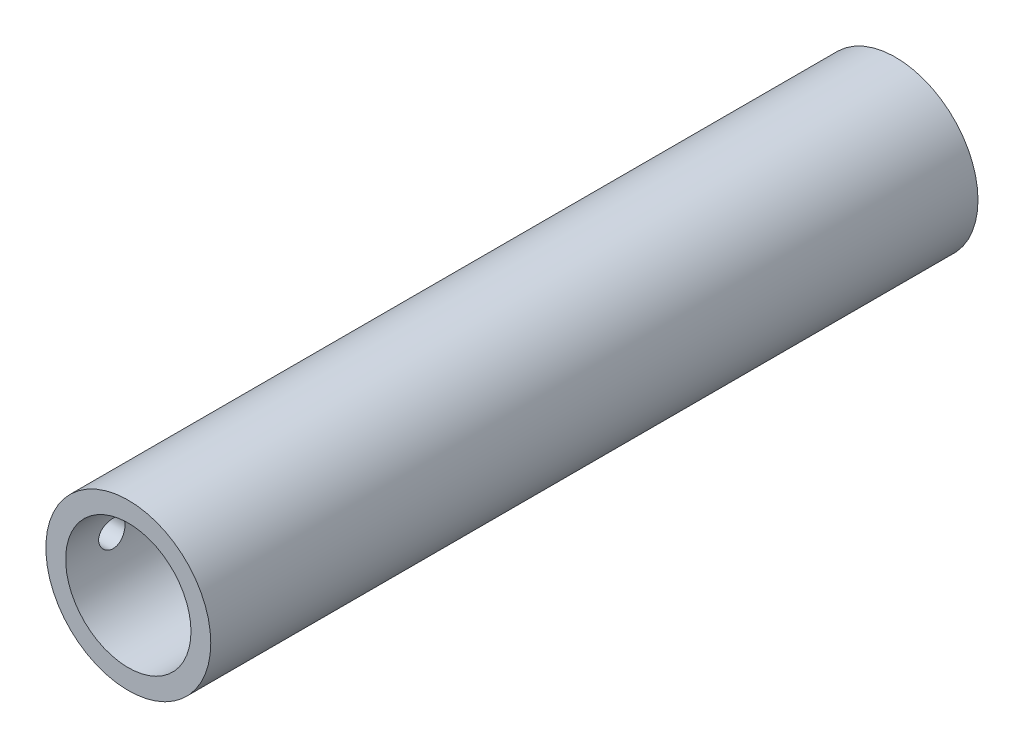
ISO-10303-21;
HEADER;
FILE_DESCRIPTION(('STEP AP214'),'2;1');
FILE_NAME('part.step','',(''),(''),'','','');
FILE_SCHEMA(('AUTOMOTIVE_DESIGN { 1 0 10303 214 1 1 1 1 }'));
ENDSEC;
DATA;
#1=APPLICATION_CONTEXT('core data for automotive mechanical design processes');
#2=APPLICATION_PROTOCOL_DEFINITION('international standard','automotive_design',2000,#1);
#3=PRODUCT_CONTEXT('',#1,'mechanical');
#4=PRODUCT('Part','Part','',(#3));
#5=PRODUCT_RELATED_PRODUCT_CATEGORY('part','',(#4));
#6=PRODUCT_DEFINITION_FORMATION('','',#4);
#7=PRODUCT_DEFINITION_CONTEXT('part definition',#1,'design');
#8=PRODUCT_DEFINITION('design','',#6,#7);
#9=PRODUCT_DEFINITION_SHAPE('','',#8);
#10=(LENGTH_UNIT() NAMED_UNIT(*) SI_UNIT(.MILLI.,.METRE.));
#11=(NAMED_UNIT(*) PLANE_ANGLE_UNIT() SI_UNIT($,.RADIAN.));
#12=(NAMED_UNIT(*) SI_UNIT($,.STERADIAN.) SOLID_ANGLE_UNIT());
#13=UNCERTAINTY_MEASURE_WITH_UNIT(LENGTH_MEASURE(1.E-05),#10,'distance_accuracy_value','');
#14=(GEOMETRIC_REPRESENTATION_CONTEXT(3) GLOBAL_UNCERTAINTY_ASSIGNED_CONTEXT((#13)) GLOBAL_UNIT_ASSIGNED_CONTEXT((#10,
#11,#12)) REPRESENTATION_CONTEXT('',''));
#15=CARTESIAN_POINT('',(0.,0.,0.));
#16=DIRECTION('',(0.,0.,1.));
#17=DIRECTION('',(1.,0.,0.));
#18=AXIS2_PLACEMENT_3D('',#15,#16,#17);
#19=CARTESIAN_POINT('',(12.7,12.7,116.3));
#20=DIRECTION('',(0.,0.,-1.));
#21=DIRECTION('',(-1.,0.,0.));
#22=AXIS2_PLACEMENT_3D('',#19,#20,#21);
#23=CYLINDRICAL_SURFACE('',#22,12.5);
#24=CARTESIAN_POINT('',(12.7,12.7,116.3));
#25=DIRECTION('',(0.,0.,1.));
#26=DIRECTION('',(1.,0.,0.));
#27=AXIS2_PLACEMENT_3D('',#24,#25,#26);
#28=CIRCLE('',#27,12.5);
#29=CARTESIAN_POINT('',(25.2,12.7,116.3));
#30=VERTEX_POINT('',#29);
#31=EDGE_CURVE('E10',#30,#30,#28,.T.);
#32=ORIENTED_EDGE('',*,*,#31,.F.);
#33=EDGE_LOOP('',(#32));
#34=FACE_BOUND('',#33,.T.);
#35=CARTESIAN_POINT('',(12.7,12.7,0.));
#36=DIRECTION('',(0.,0.,1.));
#37=DIRECTION('',(1.,0.,0.));
#38=AXIS2_PLACEMENT_3D('',#35,#36,#37);
#39=CIRCLE('',#38,12.5);
#40=CARTESIAN_POINT('',(25.2,12.7,0.));
#41=VERTEX_POINT('',#40);
#42=EDGE_CURVE('E38',#41,#41,#39,.T.);
#43=ORIENTED_EDGE('',*,*,#42,.T.);
#44=EDGE_LOOP('',(#43));
#45=FACE_BOUND('',#44,.T.);
#46=CARTESIAN_POINT('',(0.199999999999994,12.7,111.3));
#47=CARTESIAN_POINT('',(0.200001865790051,12.5884229798721,111.29999547137));
#48=CARTESIAN_POINT('',(0.201509532362699,12.4767834761397,111.290631392707));
#49=CARTESIAN_POINT('',(0.20737876581435,12.2566312203418,111.253435552302));
#50=CARTESIAN_POINT('',(0.211743020689556,12.1481215138648,111.2255863961));
#51=CARTESIAN_POINT('',(0.222835535987103,11.9374462288737,111.152279119554));
#52=CARTESIAN_POINT('',(0.229561922601623,11.835275697056,111.106834953879));
#53=CARTESIAN_POINT('',(0.244637601988447,11.6400241556545,110.999663205602));
#54=CARTESIAN_POINT('',(0.252986692791456,11.5469420170511,110.937937649116));
#55=CARTESIAN_POINT('',(0.270463570966221,11.3716725039533,110.799374395738));
#56=CARTESIAN_POINT('',(0.279596995569625,11.289577133474,110.722421021055));
#57=CARTESIAN_POINT('',(0.297569600906174,11.1394058971622,110.555835532725));
#58=CARTESIAN_POINT('',(0.306408763735023,11.0713308830929,110.466202649331));
#59=CARTESIAN_POINT('',(0.322846664218036,10.9507683458679,110.276176113848));
#60=CARTESIAN_POINT('',(0.330438116515013,10.898371001539,110.175724562638));
#61=CARTESIAN_POINT('',(0.343443340504492,10.8112276903739,109.967304337131));
#62=CARTESIAN_POINT('',(0.348857247496583,10.7764806268199,109.859336130363));
#63=CARTESIAN_POINT('',(0.356838552576357,10.7259124131867,109.639919623135));
#64=CARTESIAN_POINT('',(0.359429746996376,10.709932955496,109.52850868905));
#65=CARTESIAN_POINT('',(0.361544328408883,10.6968628866242,109.304559012915));
#66=CARTESIAN_POINT('',(0.361067915557615,10.6997710430581,109.192020344926));
#67=CARTESIAN_POINT('',(0.357122851939615,10.7242645294187,108.970134969501));
#68=CARTESIAN_POINT('',(0.353682592082325,10.7456726527359,108.860768122639));
#69=CARTESIAN_POINT('',(0.34424186798262,10.8062805648616,108.647198928902));
#70=CARTESIAN_POINT('',(0.338241322239991,10.8454809200433,108.542996746549));
#71=CARTESIAN_POINT('',(0.324325181733982,10.9407421125279,108.342180732144));
#72=CARTESIAN_POINT('',(0.316401190693086,10.9968771418249,108.245602700315));
#73=CARTESIAN_POINT('',(0.299536918850759,11.1243614736764,108.063169728315));
#74=CARTESIAN_POINT('',(0.290596562348881,11.1957119098446,107.977315587877));
#75=CARTESIAN_POINT('',(0.272581875474605,11.3525701591211,107.817741199563));
#76=CARTESIAN_POINT('',(0.263507179972884,11.438230144544,107.744170492931));
#77=CARTESIAN_POINT('',(0.246340729153335,11.6207596253195,107.612425261157));
#78=CARTESIAN_POINT('',(0.238248979282463,11.7176291827836,107.55425082133));
#79=CARTESIAN_POINT('',(0.223949943005593,11.9199641116909,107.454938321886));
#80=CARTESIAN_POINT('',(0.217744042429352,12.0254357325785,107.413812782731));
#81=CARTESIAN_POINT('',(0.207927244063983,12.2419101660602,107.349900642074));
#82=CARTESIAN_POINT('',(0.204316146403834,12.3529125519293,107.327112628063));
#83=CARTESIAN_POINT('',(0.200122535449385,12.576007944598,107.300723529987));
#84=CARTESIAN_POINT('',(0.199507600324322,12.6880760663396,107.296917034042));
#85=CARTESIAN_POINT('',(0.20128702490669,12.9112493715111,107.308052381609));
#86=CARTESIAN_POINT('',(0.203681278194504,13.0223545888543,107.322993562111));
#87=CARTESIAN_POINT('',(0.211189998476612,13.2398187982355,107.371029298189));
#88=CARTESIAN_POINT('',(0.216289321974441,13.3462006744021,107.404022825305));
#89=CARTESIAN_POINT('',(0.22863853852238,13.551922990586,107.48711946853));
#90=CARTESIAN_POINT('',(0.235888544354665,13.6512630609912,107.537223481938));
#91=CARTESIAN_POINT('',(0.25181478481573,13.8409786511289,107.653593999303));
#92=CARTESIAN_POINT('',(0.260502224416903,13.9312740030957,107.719989636023));
#93=CARTESIAN_POINT('',(0.278304045862928,14.0995141563953,107.866880154363));
#94=CARTESIAN_POINT('',(0.28741845611662,14.1774581344028,107.947375975128));
#95=CARTESIAN_POINT('',(0.30515097269264,14.3195386653,108.121100388104));
#96=CARTESIAN_POINT('',(0.313763535462191,14.3835368741472,108.214442778787));
#97=CARTESIAN_POINT('',(0.329415896982546,14.4949448921012,108.41067378112));
#98=CARTESIAN_POINT('',(0.336455742665443,14.5423551962383,108.513562107777));
#99=CARTESIAN_POINT('',(0.348124587952189,14.6190315835415,108.725566959218));
#100=CARTESIAN_POINT('',(0.35276294122775,14.6483681490252,108.834657454598));
#101=CARTESIAN_POINT('',(0.35912767779278,14.6882871855446,109.056297569992));
#102=CARTESIAN_POINT('',(0.360854292576136,14.6988711474845,109.168846914291));
#103=CARTESIAN_POINT('',(0.36119062414307,14.7009454661839,109.392829493437));
#104=CARTESIAN_POINT('',(0.35983587178348,14.6926534782145,109.50426071954));
#105=CARTESIAN_POINT('',(0.354239717417886,14.6576801797297,109.724121322627));
#106=CARTESIAN_POINT('',(0.349998322721247,14.6309989157786,109.832550707212));
#107=CARTESIAN_POINT('',(0.339119841379898,14.5600852185506,110.043255350016));
#108=CARTESIAN_POINT('',(0.332485115689699,14.5158700777013,110.145536557641));
#109=CARTESIAN_POINT('',(0.317565023259193,14.4111657728424,110.341264467673));
#110=CARTESIAN_POINT('',(0.309279585260845,14.3506759062451,110.434710788438));
#111=CARTESIAN_POINT('',(0.291878319229866,14.2143566359968,110.611218580837));
#112=CARTESIAN_POINT('',(0.28275439782197,14.1383666458096,110.6941552479));
#113=CARTESIAN_POINT('',(0.264769987002445,13.9735433435795,110.846175381398));
#114=CARTESIAN_POINT('',(0.255909559030024,13.88470706402,110.915255638149));
#115=CARTESIAN_POINT('',(0.23938594370848,13.6960483465773,111.037997466172));
#116=CARTESIAN_POINT('',(0.231730673470411,13.5961600497949,111.091558873887));
#117=CARTESIAN_POINT('',(0.218557124953191,13.3887251669687,111.181061292899));
#118=CARTESIAN_POINT('',(0.213036684376697,13.2811864612098,111.217020143104));
#119=CARTESIAN_POINT('',(0.205982441036099,13.094335518838,111.262345738735));
#120=CARTESIAN_POINT('',(0.203750822168247,13.0161634774987,111.276443902793));
#121=CARTESIAN_POINT('',(0.200758949328591,12.8586714801517,111.295272572864));
#122=CARTESIAN_POINT('',(0.199998673084137,12.7793515415388,111.300003220679));
#123=CARTESIAN_POINT('',(0.199999999999994,12.7,111.3));
#124=B_SPLINE_CURVE_WITH_KNOTS('',3,(#46,#47,#48,#49,#50,#51,#52,#53,#54,#55,#56,#57,#58,#59,
#60,#61,#62,#63,#64,#65,#66,#67,#68,#69,#70,#71,#72,#73,#74,#75,#76,#77,#78,#79,#80,#81,#82,#83,
#84,#85,#86,#87,#88,#89,#90,#91,#92,#93,#94,#95,#96,#97,#98,#99,#100,#101,#102,#103,#104,#105,
#106,#107,#108,#109,#110,#111,#112,#113,#114,#115,#116,#117,#118,#119,#120,#121,#122,#123),
.UNSPECIFIED.,.T.,.F.,(4,2,2,2,2,2,2,2,2,2,2,2,2,2,2,2,2,2,2,2,2,2,2,2,2,2,2,2,2,2,2,2,2,2,2,2,
2,2,4),(0.,0.33444104662294,0.669197249319464,1.00368849765686,1.33813814029103,
1.67523334608234,2.01234902501281,2.35136809625946,2.69036609964137,3.0264835846965,
3.36257913887025,3.69549055890499,4.02841257712191,4.36281487068316,4.69724208737483,
5.03548313337389,5.37372605363721,5.71221693636018,6.05068174320193,6.38547572150113,
6.72025786018133,7.05318530227045,7.38613020622254,7.72180459283843,8.05750134563268,
8.39639027086603,8.73526908182519,9.07281785760311,9.41033979575024,9.74398956846138,
10.0776384963298,10.4109591848676,10.7442942653298,11.0812763085404,11.4183363199473,
11.7575256865023,12.0963705940351,12.3342225666998,12.5720709388195),.UNSPECIFIED.);
#125=CARTESIAN_POINT('',(0.199999999999994,12.7,111.3));
#126=VERTEX_POINT('',#125);
#127=EDGE_CURVE('E53',#126,#126,#124,.T.);
#128=ORIENTED_EDGE('',*,*,#127,.T.);
#129=EDGE_LOOP('',(#128));
#130=FACE_BOUND('',#129,.T.);
#131=CARTESIAN_POINT('',(0.199999999999994,12.7,31.8));
#132=CARTESIAN_POINT('',(0.200001865790051,12.5884229798721,31.7999954713698));
#133=CARTESIAN_POINT('',(0.201509532362699,12.4767834761397,31.7906313927068));
#134=CARTESIAN_POINT('',(0.20737876581435,12.2566312203418,31.753435552302));
#135=CARTESIAN_POINT('',(0.211743020689556,12.1481215138648,31.7255863960999));
#136=CARTESIAN_POINT('',(0.222835535987104,11.9374462288737,31.652279119554));
#137=CARTESIAN_POINT('',(0.229561922601624,11.835275697056,31.6068349538792));
#138=CARTESIAN_POINT('',(0.244637601988447,11.6400241556545,31.4996632056022));
#139=CARTESIAN_POINT('',(0.252986692791454,11.5469420170511,31.4379376491164));
#140=CARTESIAN_POINT('',(0.270463570966219,11.3716725039533,31.2993743957376));
#141=CARTESIAN_POINT('',(0.279596995569624,11.289577133474,31.2224210210548));
#142=CARTESIAN_POINT('',(0.297569600906175,11.1394058971622,31.055835532725));
#143=CARTESIAN_POINT('',(0.306408763735025,11.0713308830929,30.9662026493313));
#144=CARTESIAN_POINT('',(0.322846664218039,10.9507683458679,30.7761761138479));
#145=CARTESIAN_POINT('',(0.330438116515016,10.898371001539,30.6757245626384));
#146=CARTESIAN_POINT('',(0.343443340504494,10.8112276903739,30.4673043371312));
#147=CARTESIAN_POINT('',(0.348857247496586,10.7764806268199,30.3593361303625));
#148=CARTESIAN_POINT('',(0.356838552576359,10.7259124131867,30.1399196231352));
#149=CARTESIAN_POINT('',(0.359429746996376,10.709932955496,30.02850868905));
#150=CARTESIAN_POINT('',(0.361544328408884,10.6968628866242,29.8045590129146));
#151=CARTESIAN_POINT('',(0.361067915557617,10.6997710430581,29.6920203449255));
#152=CARTESIAN_POINT('',(0.357122851939617,10.7242645294187,29.4701349695011));
#153=CARTESIAN_POINT('',(0.353682592082325,10.7456726527359,29.360768122639));
#154=CARTESIAN_POINT('',(0.34424186798262,10.8062805648616,29.147198928902));
#155=CARTESIAN_POINT('',(0.338241322239992,10.8454809200433,29.0429967465491));
#156=CARTESIAN_POINT('',(0.324325181733983,10.9407421125279,28.8421807321441));
#157=CARTESIAN_POINT('',(0.316401190693086,10.9968771418249,28.7456027003146));
#158=CARTESIAN_POINT('',(0.299536918850757,11.1243614736764,28.5631697283147));
#159=CARTESIAN_POINT('',(0.290596562348878,11.1957119098446,28.4773155878768));
#160=CARTESIAN_POINT('',(0.272581875474606,11.3525701591211,28.3177411995627));
#161=CARTESIAN_POINT('',(0.263507179972887,11.438230144544,28.2441704929312));
#162=CARTESIAN_POINT('',(0.246340729153339,11.6207596253195,28.112425261157));
#163=CARTESIAN_POINT('',(0.238248979282464,11.7176291827836,28.0542508213299));
#164=CARTESIAN_POINT('',(0.223949943005591,11.9199641116909,27.954938321886));
#165=CARTESIAN_POINT('',(0.217744042429352,12.0254357325785,27.9138127827311));
#166=CARTESIAN_POINT('',(0.207927244063984,12.2419101660602,27.849900642074));
#167=CARTESIAN_POINT('',(0.204316146403835,12.3529125519293,27.8271126280629));
#168=CARTESIAN_POINT('',(0.200122535449385,12.576007944598,27.800723529987));
#169=CARTESIAN_POINT('',(0.199507600324322,12.6880760663396,27.7969170340423));
#170=CARTESIAN_POINT('',(0.20128702490669,12.9112493715111,27.8080523816093));
#171=CARTESIAN_POINT('',(0.203681278194503,13.0223545888543,27.8229935621113));
#172=CARTESIAN_POINT('',(0.211189998476611,13.2398187982355,27.8710292981892));
#173=CARTESIAN_POINT('',(0.216289321974442,13.3462006744021,27.9040228253045));
#174=CARTESIAN_POINT('',(0.228638538522382,13.551922990586,27.98711946853));
#175=CARTESIAN_POINT('',(0.235888544354666,13.6512630609912,28.0372234819381));
#176=CARTESIAN_POINT('',(0.25181478481573,13.8409786511289,28.1535939993033));
#177=CARTESIAN_POINT('',(0.260502224416902,13.9312740030957,28.2199896360231));
#178=CARTESIAN_POINT('',(0.278304045862928,14.0995141563953,28.3668801543625));
#179=CARTESIAN_POINT('',(0.287418456116622,14.1774581344028,28.4473759751283));
#180=CARTESIAN_POINT('',(0.305150972692643,14.3195386653,28.621100388104));
#181=CARTESIAN_POINT('',(0.313763535462194,14.3835368741472,28.7144427787868));
#182=CARTESIAN_POINT('',(0.329415896982547,14.4949448921012,28.9106737811203));
#183=CARTESIAN_POINT('',(0.336455742665444,14.5423551962384,29.0135621077771));
#184=CARTESIAN_POINT('',(0.348124587952191,14.6190315835415,29.2255669592182));
#185=CARTESIAN_POINT('',(0.352762941227754,14.6483681490252,29.3346574545979));
#186=CARTESIAN_POINT('',(0.359127677792784,14.6882871855446,29.556297569992));
#187=CARTESIAN_POINT('',(0.360854292576138,14.6988711474845,29.6688469142908));
#188=CARTESIAN_POINT('',(0.361190624143071,14.7009454661839,29.8928294934366));
#189=CARTESIAN_POINT('',(0.359835871783479,14.6926534782145,30.0042607195398));
#190=CARTESIAN_POINT('',(0.354239717417885,14.6576801797298,30.2241213226272));
#191=CARTESIAN_POINT('',(0.349998322721248,14.6309989157786,30.3325507072119));
#192=CARTESIAN_POINT('',(0.339119841379899,14.5600852185506,30.5432553500165));
#193=CARTESIAN_POINT('',(0.3324851156897,14.5158700777013,30.6455365576413));
#194=CARTESIAN_POINT('',(0.317565023259192,14.4111657728424,30.8412644676731));
#195=CARTESIAN_POINT('',(0.309279585260845,14.3506759062451,30.9347107884382));
#196=CARTESIAN_POINT('',(0.291878319229866,14.2143566359968,31.1112185808365));
#197=CARTESIAN_POINT('',(0.282754397821971,14.1383666458096,31.1941552479004));
#198=CARTESIAN_POINT('',(0.264769987002446,13.9735433435795,31.3461753813975));
#199=CARTESIAN_POINT('',(0.255909559030024,13.88470706402,31.4152556381487));
#200=CARTESIAN_POINT('',(0.23938594370848,13.6960483465773,31.5379974661718));
#201=CARTESIAN_POINT('',(0.23173067347041,13.5961600497948,31.5915588738874));
#202=CARTESIAN_POINT('',(0.218557124953191,13.3887251669687,31.6810612928991));
#203=CARTESIAN_POINT('',(0.213036684376697,13.2811864612097,31.717020143104));
#204=CARTESIAN_POINT('',(0.205982441036099,13.094335518838,31.7623457387355));
#205=CARTESIAN_POINT('',(0.203750822168247,13.0161634774987,31.7764439027928));
#206=CARTESIAN_POINT('',(0.200758949328591,12.8586714801517,31.7952725728636));
#207=CARTESIAN_POINT('',(0.199998673084137,12.7793515415388,31.8000032206792));
#208=CARTESIAN_POINT('',(0.199999999999994,12.7,31.8));
#209=B_SPLINE_CURVE_WITH_KNOTS('',3,(#131,#132,#133,#134,#135,#136,#137,#138,#139,#140,#141,
#142,#143,#144,#145,#146,#147,#148,#149,#150,#151,#152,#153,#154,#155,#156,#157,#158,#159,#160,
#161,#162,#163,#164,#165,#166,#167,#168,#169,#170,#171,#172,#173,#174,#175,#176,#177,#178,#179,
#180,#181,#182,#183,#184,#185,#186,#187,#188,#189,#190,#191,#192,#193,#194,#195,#196,#197,#198,
#199,#200,#201,#202,#203,#204,#205,#206,#207,#208),.UNSPECIFIED.,.T.,.F.,(4,2,2,2,2,2,2,2,2,2,2,
2,2,2,2,2,2,2,2,2,2,2,2,2,2,2,2,2,2,2,2,2,2,2,2,2,2,2,4),(0.,0.334441046622945,
0.669197249319468,1.00368849765686,1.33813814029104,1.67523334608234,2.01234902501281,
2.35136809625946,2.69036609964138,3.0264835846965,3.36257913887027,3.69549055890501,
4.02841257712193,4.36281487068319,4.69724208737485,5.0354831333739,5.37372605363722,
5.7122169363602,6.05068174320195,6.38547572150115,6.72025786018135,7.05318530227049,
7.38613020622257,7.72180459283846,8.05750134563271,8.39639027086605,8.73526908182522,
9.07281785760316,9.41033979575028,9.74398956846142,10.0776384963298,10.4109591848676,
10.7442942653299,11.0812763085405,11.4183363199474,11.7575256865024,12.0963705940352,
12.3342225666999,12.5720709388195),.UNSPECIFIED.);
#210=CARTESIAN_POINT('',(0.199999999999994,12.7,31.8));
#211=VERTEX_POINT('',#210);
#212=EDGE_CURVE('E84',#211,#211,#209,.T.);
#213=ORIENTED_EDGE('',*,*,#212,.T.);
#214=EDGE_LOOP('',(#213));
#215=FACE_BOUND('',#214,.T.);
#216=CARTESIAN_POINT('',(0.199999999999994,12.7,20.));
#217=CARTESIAN_POINT('',(0.200001865790051,12.5884229798721,19.9999954713698));
#218=CARTESIAN_POINT('',(0.201509532362699,12.4767834761397,19.9906313927068));
#219=CARTESIAN_POINT('',(0.20737876581435,12.2566312203418,19.953435552302));
#220=CARTESIAN_POINT('',(0.211743020689556,12.1481215138648,19.9255863960999));
#221=CARTESIAN_POINT('',(0.222835535987103,11.9374462288737,19.852279119554));
#222=CARTESIAN_POINT('',(0.229561922601623,11.835275697056,19.8068349538792));
#223=CARTESIAN_POINT('',(0.244637601988447,11.6400241556545,19.6996632056022));
#224=CARTESIAN_POINT('',(0.252986692791456,11.5469420170511,19.6379376491164));
#225=CARTESIAN_POINT('',(0.270463570966221,11.3716725039533,19.4993743957376));
#226=CARTESIAN_POINT('',(0.279596995569625,11.289577133474,19.4224210210548));
#227=CARTESIAN_POINT('',(0.297569600906175,11.1394058971622,19.255835532725));
#228=CARTESIAN_POINT('',(0.306408763735025,11.0713308830929,19.1662026493313));
#229=CARTESIAN_POINT('',(0.322846664218039,10.9507683458679,18.9761761138479));
#230=CARTESIAN_POINT('',(0.330438116515015,10.898371001539,18.8757245626384));
#231=CARTESIAN_POINT('',(0.343443340504492,10.8112276903739,18.6673043371312));
#232=CARTESIAN_POINT('',(0.348857247496583,10.7764806268199,18.5593361303625));
#233=CARTESIAN_POINT('',(0.356838552576357,10.7259124131867,18.3399196231352));
#234=CARTESIAN_POINT('',(0.359429746996377,10.709932955496,18.22850868905));
#235=CARTESIAN_POINT('',(0.361544328408885,10.6968628866242,18.0045590129146));
#236=CARTESIAN_POINT('',(0.361067915557615,10.6997710430581,17.8920203449255));
#237=CARTESIAN_POINT('',(0.357122851939615,10.7242645294187,17.6701349695011));
#238=CARTESIAN_POINT('',(0.353682592082325,10.7456726527359,17.560768122639));
#239=CARTESIAN_POINT('',(0.344241867982621,10.8062805648616,17.347198928902));
#240=CARTESIAN_POINT('',(0.338241322239992,10.8454809200433,17.2429967465491));
#241=CARTESIAN_POINT('',(0.324325181733983,10.9407421125279,17.0421807321441));
#242=CARTESIAN_POINT('',(0.316401190693087,10.9968771418249,16.9456027003146));
#243=CARTESIAN_POINT('',(0.299536918850759,11.1243614736764,16.7631697283147));
#244=CARTESIAN_POINT('',(0.290596562348879,11.1957119098446,16.6773155878768));
#245=CARTESIAN_POINT('',(0.272581875474605,11.3525701591211,16.5177411995627));
#246=CARTESIAN_POINT('',(0.263507179972887,11.438230144544,16.4441704929312));
#247=CARTESIAN_POINT('',(0.246340729153339,11.6207596253195,16.312425261157));
#248=CARTESIAN_POINT('',(0.238248979282464,11.7176291827836,16.2542508213299));
#249=CARTESIAN_POINT('',(0.223949943005592,11.9199641116909,16.154938321886));
#250=CARTESIAN_POINT('',(0.217744042429352,12.0254357325785,16.1138127827311));
#251=CARTESIAN_POINT('',(0.207927244063984,12.2419101660602,16.049900642074));
#252=CARTESIAN_POINT('',(0.204316146403835,12.3529125519293,16.0271126280629));
#253=CARTESIAN_POINT('',(0.200122535449385,12.576007944598,16.000723529987));
#254=CARTESIAN_POINT('',(0.199507600324322,12.6880760663396,15.9969170340423));
#255=CARTESIAN_POINT('',(0.20128702490669,12.9112493715111,16.0080523816093));
#256=CARTESIAN_POINT('',(0.203681278194503,13.0223545888543,16.0229935621113));
#257=CARTESIAN_POINT('',(0.211189998476612,13.2398187982355,16.0710292981892));
#258=CARTESIAN_POINT('',(0.216289321974442,13.3462006744021,16.1040228253045));
#259=CARTESIAN_POINT('',(0.228638538522383,13.551922990586,16.18711946853));
#260=CARTESIAN_POINT('',(0.235888544354667,13.6512630609912,16.2372234819381));
#261=CARTESIAN_POINT('',(0.25181478481573,13.8409786511289,16.3535939993033));
#262=CARTESIAN_POINT('',(0.260502224416902,13.9312740030957,16.4199896360231));
#263=CARTESIAN_POINT('',(0.278304045862928,14.0995141563953,16.5668801543625));
#264=CARTESIAN_POINT('',(0.287418456116622,14.1774581344028,16.6473759751283));
#265=CARTESIAN_POINT('',(0.305150972692644,14.3195386653,16.821100388104));
#266=CARTESIAN_POINT('',(0.313763535462194,14.3835368741472,16.9144427787868));
#267=CARTESIAN_POINT('',(0.329415896982547,14.4949448921012,17.1106737811203));
#268=CARTESIAN_POINT('',(0.336455742665444,14.5423551962384,17.2135621077771));
#269=CARTESIAN_POINT('',(0.34812458795219,14.6190315835415,17.4255669592182));
#270=CARTESIAN_POINT('',(0.352762941227751,14.6483681490252,17.5346574545979));
#271=CARTESIAN_POINT('',(0.35912767779278,14.6882871855446,17.756297569992));
#272=CARTESIAN_POINT('',(0.360854292576135,14.6988711474845,17.8688469142908));
#273=CARTESIAN_POINT('',(0.36119062414307,14.7009454661839,18.0928294934366));
#274=CARTESIAN_POINT('',(0.359835871783479,14.6926534782145,18.2042607195398));
#275=CARTESIAN_POINT('',(0.354239717417886,14.6576801797297,18.4241213226272));
#276=CARTESIAN_POINT('',(0.349998322721248,14.6309989157786,18.5325507072119));
#277=CARTESIAN_POINT('',(0.339119841379898,14.5600852185506,18.7432553500165));
#278=CARTESIAN_POINT('',(0.332485115689699,14.5158700777013,18.8455365576413));
#279=CARTESIAN_POINT('',(0.317565023259191,14.4111657728424,19.0412644676731));
#280=CARTESIAN_POINT('',(0.309279585260845,14.3506759062451,19.1347107884382));
#281=CARTESIAN_POINT('',(0.291878319229866,14.2143566359968,19.3112185808365));
#282=CARTESIAN_POINT('',(0.28275439782197,14.1383666458096,19.3941552479004));
#283=CARTESIAN_POINT('',(0.264769987002444,13.9735433435795,19.5461753813975));
#284=CARTESIAN_POINT('',(0.255909559030023,13.88470706402,19.6152556381487));
#285=CARTESIAN_POINT('',(0.239385943708479,13.6960483465773,19.7379974661718));
#286=CARTESIAN_POINT('',(0.231730673470409,13.5961600497948,19.7915588738874));
#287=CARTESIAN_POINT('',(0.218557124953191,13.3887251669687,19.8810612928991));
#288=CARTESIAN_POINT('',(0.213036684376697,13.2811864612097,19.917020143104));
#289=CARTESIAN_POINT('',(0.2059824410361,13.094335518838,19.9623457387355));
#290=CARTESIAN_POINT('',(0.203750822168248,13.0161634774987,19.9764439027928));
#291=CARTESIAN_POINT('',(0.200758949328592,12.8586714801517,19.9952725728636));
#292=CARTESIAN_POINT('',(0.199998673084137,12.7793515415388,20.0000032206792));
#293=CARTESIAN_POINT('',(0.199999999999994,12.7,20.));
#294=B_SPLINE_CURVE_WITH_KNOTS('',3,(#216,#217,#218,#219,#220,#221,#222,#223,#224,#225,#226,
#227,#228,#229,#230,#231,#232,#233,#234,#235,#236,#237,#238,#239,#240,#241,#242,#243,#244,#245,
#246,#247,#248,#249,#250,#251,#252,#253,#254,#255,#256,#257,#258,#259,#260,#261,#262,#263,#264,
#265,#266,#267,#268,#269,#270,#271,#272,#273,#274,#275,#276,#277,#278,#279,#280,#281,#282,#283,
#284,#285,#286,#287,#288,#289,#290,#291,#292,#293),.UNSPECIFIED.,.T.,.F.,(4,2,2,2,2,2,2,2,2,2,2,
2,2,2,2,2,2,2,2,2,2,2,2,2,2,2,2,2,2,2,2,2,2,2,2,2,2,2,4),(0.,0.334441046622946,
0.669197249319468,1.00368849765686,1.33813814029104,1.67523334608234,2.0123490250128,
2.35136809625945,2.69036609964138,3.0264835846965,3.36257913887026,3.695490558905,
4.02841257712193,4.36281487068318,4.69724208737484,5.0354831333739,5.37372605363721,
5.71221693636019,6.05068174320194,6.38547572150114,6.72025786018134,7.05318530227048,
7.38613020622256,7.72180459283845,8.0575013456327,8.39639027086604,8.73526908182521,
9.07281785760315,9.41033979575027,9.74398956846142,10.0776384963298,10.4109591848676,
10.7442942653298,11.0812763085405,11.4183363199473,11.7575256865024,12.0963705940352,
12.3342225666999,12.5720709388195),.UNSPECIFIED.);
#295=CARTESIAN_POINT('',(0.199999999999994,12.7,20.));
#296=VERTEX_POINT('',#295);
#297=EDGE_CURVE('E50',#296,#296,#294,.T.);
#298=ORIENTED_EDGE('',*,*,#297,.T.);
#299=EDGE_LOOP('',(#298));
#300=FACE_BOUND('',#299,.T.);
#301=ADVANCED_FACE('F35',(#34,#45,#130,#215,#300),#23,.T.);
#302=CARTESIAN_POINT('',(12.7,12.7,116.3));
#303=DIRECTION('',(0.,0.,-1.));
#304=DIRECTION('',(-1.,0.,0.));
#305=AXIS2_PLACEMENT_3D('',#302,#303,#304);
#306=CYLINDRICAL_SURFACE('',#305,9.5);
#307=CARTESIAN_POINT('',(3.19999999999999,12.7,31.8));
#308=CARTESIAN_POINT('',(3.20000205533715,12.5889723085931,31.7999960712418));
#309=CARTESIAN_POINT('',(3.20196625988847,12.4778961803021,31.7907234125849));
#310=CARTESIAN_POINT('',(3.20961226123456,12.2588921023223,31.7539122157752));
#311=CARTESIAN_POINT('',(3.21529684758877,12.150966578452,31.7263599712917));
#312=CARTESIAN_POINT('',(3.22974985563034,11.9414610456434,31.6538853246907));
#313=CARTESIAN_POINT('',(3.23851517448194,11.8398747727475,31.6089803952481));
#314=CARTESIAN_POINT('',(3.25818056082654,11.6456833044365,31.5031289600956));
#315=CARTESIAN_POINT('',(3.26908054110326,11.5530777423257,31.4421831097378));
#316=CARTESIAN_POINT('',(3.29200060099724,11.3780889433522,31.3050163164218));
#317=CARTESIAN_POINT('',(3.30403371326972,11.295859015223,31.2286019514708));
#318=CARTESIAN_POINT('',(3.32777067473824,11.1452841990844,31.0630827481166));
#319=CARTESIAN_POINT('',(3.33947449618647,11.0769404782001,30.9739768440689));
#320=CARTESIAN_POINT('',(3.36135564417383,10.9554123866848,30.7844841859531));
#321=CARTESIAN_POINT('',(3.3715162389125,10.9023892256667,30.6839919387556));
#322=CARTESIAN_POINT('',(3.38897430447155,10.8140408709069,30.4752748015364));
#323=CARTESIAN_POINT('',(3.39627209070612,10.7787137273613,30.3670507649299));
#324=CARTESIAN_POINT('',(3.40704589936468,10.7272628820162,30.1475991879363));
#325=CARTESIAN_POINT('',(3.41057566981879,10.7108688285032,30.0364377260299));
#326=CARTESIAN_POINT('',(3.41357537070455,10.6969092987333,29.8128904097218));
#327=CARTESIAN_POINT('',(3.41304576229769,10.6993416837189,29.7005046958486));
#328=CARTESIAN_POINT('',(3.40803528321442,10.7227479653476,29.4796945431181));
#329=CARTESIAN_POINT('',(3.40362094486931,10.7434096703437,29.3712352745077));
#330=CARTESIAN_POINT('',(3.39144338681604,10.8021942939777,29.1593577868794));
#331=CARTESIAN_POINT('',(3.38367999168883,10.8403181272646,29.0559398322346));
#332=CARTESIAN_POINT('',(3.36561239571589,10.9332365747554,28.8561931158689));
#333=CARTESIAN_POINT('',(3.35528975491065,10.9881528841691,28.7599227017133));
#334=CARTESIAN_POINT('',(3.33327831200659,11.1130117127576,28.5778472073698));
#335=CARTESIAN_POINT('',(3.32158933680619,11.1829561367943,28.4920434560286));
#336=CARTESIAN_POINT('',(3.29787556581775,11.3375468073144,28.3315377182517));
#337=CARTESIAN_POINT('',(3.28584872762436,11.4224589692114,28.2570919137229));
#338=CARTESIAN_POINT('',(3.26302764227875,11.6036964938135,28.1234574942851));
#339=CARTESIAN_POINT('',(3.25223341438512,11.7000220347962,28.0642691177435));
#340=CARTESIAN_POINT('',(3.2330626782754,11.901652053397,27.9627735706725));
#341=CARTESIAN_POINT('',(3.22469071032744,12.006972919513,27.9204980454633));
#342=CARTESIAN_POINT('',(3.21134182402928,12.2234382775773,27.8543141116728));
#343=CARTESIAN_POINT('',(3.20636444907301,12.33458198413,27.8304032328119));
#344=CARTESIAN_POINT('',(3.20042992786324,12.5573388208562,27.8019954936038));
#345=CARTESIAN_POINT('',(3.19940026520822,12.6689054118907,27.7971484028368));
#346=CARTESIAN_POINT('',(3.20127477548948,12.8912541680049,27.8060592696653));
#347=CARTESIAN_POINT('',(3.2041787022025,13.0020363817464,27.8198160627495));
#348=CARTESIAN_POINT('',(3.21354851230128,13.218524951939,27.8652535040742));
#349=CARTESIAN_POINT('',(3.21997822814122,13.3242711916898,27.8967522431248));
#350=CARTESIAN_POINT('',(3.23568065103585,13.5289801635642,27.9765789362145));
#351=CARTESIAN_POINT('',(3.24495358764574,13.6279423471687,28.0249082491588));
#352=CARTESIAN_POINT('',(3.26549360649672,13.8177352139125,28.1377664128082));
#353=CARTESIAN_POINT('',(3.2767857038627,13.9084394208222,28.2025033060365));
#354=CARTESIAN_POINT('',(3.3000570773544,14.0778228093732,28.3460629854693));
#355=CARTESIAN_POINT('',(3.31203643559864,14.156500549879,28.4248874573418));
#356=CARTESIAN_POINT('',(3.33557997331445,14.3009676189046,28.5959863577544));
#357=CARTESIAN_POINT('',(3.34713364467744,14.3665153329962,28.6884664985588));
#358=CARTESIAN_POINT('',(3.36828413844459,14.4811487153217,28.8833292192984));
#359=CARTESIAN_POINT('',(3.37788104306599,14.5302350752662,28.9857113829149));
#360=CARTESIAN_POINT('',(3.39394431056886,14.6102340489524,29.1969350471407));
#361=CARTESIAN_POINT('',(3.40042769763351,14.6412456960379,29.3057376821955));
#362=CARTESIAN_POINT('',(3.40956309186598,14.6845099756156,29.5271623193155));
#363=CARTESIAN_POINT('',(3.41221566033939,14.6967653563604,29.6397837593598));
#364=CARTESIAN_POINT('',(3.41335558081066,14.7020590183931,29.8632177269964));
#365=CARTESIAN_POINT('',(3.41192583493732,14.6954797790407,29.9740209436741));
#366=CARTESIAN_POINT('',(3.40524869897417,14.6641411282837,30.1929025699446));
#367=CARTESIAN_POINT('',(3.40000134720372,14.6393818993614,30.300981006876));
#368=CARTESIAN_POINT('',(3.386319174847,14.5725646330771,30.5110683845551));
#369=CARTESIAN_POINT('',(3.37789389511312,14.5305583421692,30.6130944451996));
#370=CARTESIAN_POINT('',(3.35880071906286,14.4304853373043,30.8087090330766));
#371=CARTESIAN_POINT('',(3.34813260923464,14.372417094123,30.9022967557874));
#372=CARTESIAN_POINT('',(3.32550545218155,14.2405830035246,31.0802721531369));
#373=CARTESIAN_POINT('',(3.31352592954252,14.1665429242392,31.1644541274204));
#374=CARTESIAN_POINT('',(3.28976743387683,14.0054274241297,31.3193247108892));
#375=CARTESIAN_POINT('',(3.27798850768684,13.9183490042641,31.3900102071205));
#376=CARTESIAN_POINT('',(3.25579354889286,13.7323889870608,31.5166769982541));
#377=CARTESIAN_POINT('',(3.24539528108052,13.6333799843543,31.5724745168107));
#378=CARTESIAN_POINT('',(3.2273098162959,13.4271945380683,31.666549017979));
#379=CARTESIAN_POINT('',(3.21962027025175,13.3200252698708,31.7048411902941));
#380=CARTESIAN_POINT('',(3.20924562930547,13.1272392571059,31.7557266942803));
#381=CARTESIAN_POINT('',(3.20579945700289,13.0426909006795,31.7722984508132));
#382=CARTESIAN_POINT('',(3.20117588928384,12.8721046933561,31.7944364150951));
#383=CARTESIAN_POINT('',(3.19999840673533,12.7860668997911,31.8000030455108));
#384=CARTESIAN_POINT('',(3.19999999999999,12.7,31.8));
#385=B_SPLINE_CURVE_WITH_KNOTS('',3,(#307,#308,#309,#310,#311,#312,#313,#314,#315,#316,#317,
#318,#319,#320,#321,#322,#323,#324,#325,#326,#327,#328,#329,#330,#331,#332,#333,#334,#335,#336,
#337,#338,#339,#340,#341,#342,#343,#344,#345,#346,#347,#348,#349,#350,#351,#352,#353,#354,#355,
#356,#357,#358,#359,#360,#361,#362,#363,#364,#365,#366,#367,#368,#369,#370,#371,#372,#373,#374,
#375,#376,#377,#378,#379,#380,#381,#382,#383,#384),.UNSPECIFIED.,.T.,.F.,(4,2,2,2,2,2,2,2,2,2,2,
2,2,2,2,2,2,2,2,2,2,2,2,2,2,2,2,2,2,2,2,2,2,2,2,2,2,2,4),(0.,0.332768117031278,
0.665786031430696,0.998469495255926,1.33113936940165,1.6682591973254,2.00540734820485,
2.34598369082387,2.68652249939279,3.02213605752825,3.35771148920196,3.68764911424788,
4.01760402307772,4.35000918418411,4.68245650359802,5.0215487686612,5.36064633105725,
5.70037543797721,6.04005883898083,6.37347176163494,6.70686381525021,7.03689822691307,
7.36695929182641,7.70143535229665,8.0359514617754,8.37614947767227,8.71633319656388,
9.05463505055368,9.39288733028469,9.72431965754212,10.0557486580816,10.3861904535976,
10.7166637206083,11.0533410961237,11.3900960325031,11.7308334079192,12.0712745555644,
12.3292410128771,12.5871975624484),.UNSPECIFIED.);
#386=CARTESIAN_POINT('',(3.19999999999999,12.7,31.8));
#387=VERTEX_POINT('',#386);
#388=EDGE_CURVE('E77',#387,#387,#385,.T.);
#389=ORIENTED_EDGE('',*,*,#388,.F.);
#390=EDGE_LOOP('',(#389));
#391=FACE_BOUND('',#390,.T.);
#392=CARTESIAN_POINT('',(12.7,12.7,0.));
#393=DIRECTION('',(0.,0.,1.));
#394=DIRECTION('',(1.,0.,0.));
#395=AXIS2_PLACEMENT_3D('',#392,#393,#394);
#396=CIRCLE('',#395,9.5);
#397=CARTESIAN_POINT('',(22.2,12.7,0.));
#398=VERTEX_POINT('',#397);
#399=EDGE_CURVE('E47',#398,#398,#396,.T.);
#400=ORIENTED_EDGE('',*,*,#399,.F.);
#401=EDGE_LOOP('',(#400));
#402=FACE_BOUND('',#401,.T.);
#403=CARTESIAN_POINT('',(12.7,12.7,116.3));
#404=DIRECTION('',(0.,0.,1.));
#405=DIRECTION('',(1.,0.,0.));
#406=AXIS2_PLACEMENT_3D('',#403,#404,#405);
#407=CIRCLE('',#406,9.5);
#408=CARTESIAN_POINT('',(22.2,12.7,116.3));
#409=VERTEX_POINT('',#408);
#410=EDGE_CURVE('E45',#409,#409,#407,.T.);
#411=ORIENTED_EDGE('',*,*,#410,.T.);
#412=EDGE_LOOP('',(#411));
#413=FACE_BOUND('',#412,.T.);
#414=CARTESIAN_POINT('',(3.19999999999999,12.7,111.3));
#415=CARTESIAN_POINT('',(3.20000205533715,12.5889723085931,111.299996071242));
#416=CARTESIAN_POINT('',(3.20196625988847,12.4778961803021,111.290723412585));
#417=CARTESIAN_POINT('',(3.20961226123456,12.2588921023223,111.253912215775));
#418=CARTESIAN_POINT('',(3.21529684758877,12.150966578452,111.226359971292));
#419=CARTESIAN_POINT('',(3.22974985563034,11.9414610456434,111.153885324691));
#420=CARTESIAN_POINT('',(3.23851517448194,11.8398747727475,111.108980395248));
#421=CARTESIAN_POINT('',(3.25818056082654,11.6456833044365,111.003128960096));
#422=CARTESIAN_POINT('',(3.26908054110326,11.5530777423257,110.942183109738));
#423=CARTESIAN_POINT('',(3.29200060099724,11.3780889433522,110.805016316422));
#424=CARTESIAN_POINT('',(3.30403371326972,11.295859015223,110.728601951471));
#425=CARTESIAN_POINT('',(3.32777067473824,11.1452841990844,110.563082748117));
#426=CARTESIAN_POINT('',(3.33947449618647,11.0769404782001,110.473976844069));
#427=CARTESIAN_POINT('',(3.36135564417383,10.9554123866848,110.284484185953));
#428=CARTESIAN_POINT('',(3.3715162389125,10.9023892256668,110.183991938756));
#429=CARTESIAN_POINT('',(3.38897430447155,10.8140408709069,109.975274801536));
#430=CARTESIAN_POINT('',(3.39627209070612,10.7787137273613,109.86705076493));
#431=CARTESIAN_POINT('',(3.40704589936468,10.7272628820162,109.647599187936));
#432=CARTESIAN_POINT('',(3.41057566981879,10.7108688285032,109.53643772603));
#433=CARTESIAN_POINT('',(3.41357537070455,10.6969092987333,109.312890409722));
#434=CARTESIAN_POINT('',(3.41304576229769,10.6993416837189,109.200504695849));
#435=CARTESIAN_POINT('',(3.40803528321442,10.7227479653476,108.979694543118));
#436=CARTESIAN_POINT('',(3.40362094486931,10.7434096703437,108.871235274508));
#437=CARTESIAN_POINT('',(3.39144338681604,10.8021942939777,108.659357786879));
#438=CARTESIAN_POINT('',(3.38367999168883,10.8403181272646,108.555939832235));
#439=CARTESIAN_POINT('',(3.36561239571589,10.9332365747554,108.356193115869));
#440=CARTESIAN_POINT('',(3.35528975491065,10.9881528841691,108.259922701713));
#441=CARTESIAN_POINT('',(3.33327831200659,11.1130117127576,108.07784720737));
#442=CARTESIAN_POINT('',(3.32158933680619,11.1829561367943,107.992043456029));
#443=CARTESIAN_POINT('',(3.29787556581775,11.3375468073145,107.831537718252));
#444=CARTESIAN_POINT('',(3.28584872762436,11.4224589692114,107.757091913723));
#445=CARTESIAN_POINT('',(3.26302764227875,11.6036964938135,107.623457494285));
#446=CARTESIAN_POINT('',(3.25223341438512,11.7000220347962,107.564269117744));
#447=CARTESIAN_POINT('',(3.2330626782754,11.901652053397,107.462773570673));
#448=CARTESIAN_POINT('',(3.22469071032744,12.006972919513,107.420498045463));
#449=CARTESIAN_POINT('',(3.21134182402928,12.2234382775773,107.354314111673));
#450=CARTESIAN_POINT('',(3.206364449073,12.33458198413,107.330403232812));
#451=CARTESIAN_POINT('',(3.20042992786324,12.5573388208562,107.301995493604));
#452=CARTESIAN_POINT('',(3.19940026520822,12.6689054118907,107.297148402837));
#453=CARTESIAN_POINT('',(3.20127477548948,12.8912541680049,107.306059269665));
#454=CARTESIAN_POINT('',(3.2041787022025,13.0020363817464,107.31981606275));
#455=CARTESIAN_POINT('',(3.21354851230128,13.218524951939,107.365253504074));
#456=CARTESIAN_POINT('',(3.21997822814122,13.3242711916898,107.396752243125));
#457=CARTESIAN_POINT('',(3.23568065103585,13.5289801635642,107.476578936214));
#458=CARTESIAN_POINT('',(3.24495358764574,13.6279423471687,107.524908249159));
#459=CARTESIAN_POINT('',(3.26549360649672,13.8177352139125,107.637766412808));
#460=CARTESIAN_POINT('',(3.2767857038627,13.9084394208222,107.702503306037));
#461=CARTESIAN_POINT('',(3.3000570773544,14.0778228093732,107.846062985469));
#462=CARTESIAN_POINT('',(3.31203643559864,14.156500549879,107.924887457342));
#463=CARTESIAN_POINT('',(3.33557997331445,14.3009676189046,108.095986357754));
#464=CARTESIAN_POINT('',(3.34713364467744,14.3665153329962,108.188466498559));
#465=CARTESIAN_POINT('',(3.3682841384446,14.4811487153217,108.383329219298));
#466=CARTESIAN_POINT('',(3.37788104306599,14.5302350752662,108.485711382915));
#467=CARTESIAN_POINT('',(3.39394431056886,14.6102340489523,108.696935047141));
#468=CARTESIAN_POINT('',(3.40042769763351,14.6412456960379,108.805737682196));
#469=CARTESIAN_POINT('',(3.40956309186598,14.6845099756156,109.027162319316));
#470=CARTESIAN_POINT('',(3.41221566033939,14.6967653563604,109.13978375936));
#471=CARTESIAN_POINT('',(3.41335558081066,14.7020590183931,109.363217726996));
#472=CARTESIAN_POINT('',(3.41192583493732,14.6954797790407,109.474020943674));
#473=CARTESIAN_POINT('',(3.40524869897417,14.6641411282837,109.692902569945));
#474=CARTESIAN_POINT('',(3.40000134720372,14.6393818993614,109.800981006876));
#475=CARTESIAN_POINT('',(3.386319174847,14.5725646330771,110.011068384555));
#476=CARTESIAN_POINT('',(3.37789389511311,14.5305583421692,110.1130944452));
#477=CARTESIAN_POINT('',(3.35880071906287,14.4304853373043,110.308709033077));
#478=CARTESIAN_POINT('',(3.34813260923464,14.372417094123,110.402296755787));
#479=CARTESIAN_POINT('',(3.32550545218155,14.2405830035246,110.580272153137));
#480=CARTESIAN_POINT('',(3.31352592954252,14.1665429242392,110.66445412742));
#481=CARTESIAN_POINT('',(3.28976743387683,14.0054274241297,110.819324710889));
#482=CARTESIAN_POINT('',(3.27798850768684,13.9183490042641,110.89001020712));
#483=CARTESIAN_POINT('',(3.25579354889286,13.7323889870608,111.016676998254));
#484=CARTESIAN_POINT('',(3.24539528108052,13.6333799843543,111.072474516811));
#485=CARTESIAN_POINT('',(3.2273098162959,13.4271945380684,111.166549017979));
#486=CARTESIAN_POINT('',(3.21962027025175,13.3200252698708,111.204841190294));
#487=CARTESIAN_POINT('',(3.20924562930547,13.1272392571059,111.25572669428));
#488=CARTESIAN_POINT('',(3.20579945700289,13.0426909006795,111.272298450813));
#489=CARTESIAN_POINT('',(3.20117588928384,12.8721046933561,111.294436415095));
#490=CARTESIAN_POINT('',(3.19999840673533,12.7860668997911,111.300003045511));
#491=CARTESIAN_POINT('',(3.19999999999999,12.7,111.3));
#492=B_SPLINE_CURVE_WITH_KNOTS('',3,(#414,#415,#416,#417,#418,#419,#420,#421,#422,#423,#424,
#425,#426,#427,#428,#429,#430,#431,#432,#433,#434,#435,#436,#437,#438,#439,#440,#441,#442,#443,
#444,#445,#446,#447,#448,#449,#450,#451,#452,#453,#454,#455,#456,#457,#458,#459,#460,#461,#462,
#463,#464,#465,#466,#467,#468,#469,#470,#471,#472,#473,#474,#475,#476,#477,#478,#479,#480,#481,
#482,#483,#484,#485,#486,#487,#488,#489,#490,#491),.UNSPECIFIED.,.T.,.F.,(4,2,2,2,2,2,2,2,2,2,2,
2,2,2,2,2,2,2,2,2,2,2,2,2,2,2,2,2,2,2,2,2,2,2,2,2,2,2,4),(0.,0.332768117031272,
0.665786031430694,0.998469495255916,1.33113936940164,1.66825919732541,2.00540734820484,
2.34598369082386,2.68652249939277,3.02213605752824,3.35771148920197,3.68764911424789,
4.01760402307771,4.3500091841841,4.68245650359801,5.02154876866119,5.36064633105724,
5.7003754379772,6.04005883898081,6.37347176163492,6.70686381525019,7.03689822691304,
7.36695929182638,7.70143535229662,8.03595146177537,8.37614947767227,8.71633319656387,
9.05463505055368,9.39288733028467,9.72431965754209,10.0557486580815,10.3861904535976,
10.7166637206082,11.0533410961237,11.3900960325031,11.7308334079191,12.0712745555643,
12.329241012877,12.5871975624483),.UNSPECIFIED.);
#493=CARTESIAN_POINT('',(3.19999999999999,12.7,111.3));
#494=VERTEX_POINT('',#493);
#495=EDGE_CURVE('E61',#494,#494,#492,.T.);
#496=ORIENTED_EDGE('',*,*,#495,.F.);
#497=EDGE_LOOP('',(#496));
#498=FACE_BOUND('',#497,.T.);
#499=CARTESIAN_POINT('',(3.19999999999999,12.7,20.));
#500=CARTESIAN_POINT('',(3.20000205533715,12.5889723085931,19.9999960712418));
#501=CARTESIAN_POINT('',(3.20196625988847,12.4778961803021,19.9907234125849));
#502=CARTESIAN_POINT('',(3.20961226123456,12.2588921023223,19.9539122157752));
#503=CARTESIAN_POINT('',(3.21529684758877,12.150966578452,19.9263599712917));
#504=CARTESIAN_POINT('',(3.22974985563034,11.9414610456434,19.8538853246907));
#505=CARTESIAN_POINT('',(3.23851517448194,11.8398747727475,19.8089803952481));
#506=CARTESIAN_POINT('',(3.25818056082654,11.6456833044365,19.7031289600956));
#507=CARTESIAN_POINT('',(3.26908054110326,11.5530777423257,19.6421831097378));
#508=CARTESIAN_POINT('',(3.29200060099724,11.3780889433522,19.5050163164218));
#509=CARTESIAN_POINT('',(3.30403371326972,11.295859015223,19.4286019514708));
#510=CARTESIAN_POINT('',(3.32777067473824,11.1452841990844,19.2630827481166));
#511=CARTESIAN_POINT('',(3.33947449618647,11.0769404782001,19.1739768440689));
#512=CARTESIAN_POINT('',(3.36135564417383,10.9554123866848,18.9844841859531));
#513=CARTESIAN_POINT('',(3.3715162389125,10.9023892256667,18.8839919387556));
#514=CARTESIAN_POINT('',(3.38897430447155,10.8140408709069,18.6752748015364));
#515=CARTESIAN_POINT('',(3.39627209070612,10.7787137273613,18.5670507649299));
#516=CARTESIAN_POINT('',(3.40704589936468,10.7272628820162,18.3475991879363));
#517=CARTESIAN_POINT('',(3.41057566981879,10.7108688285032,18.2364377260299));
#518=CARTESIAN_POINT('',(3.41357537070455,10.6969092987333,18.0128904097218));
#519=CARTESIAN_POINT('',(3.41304576229769,10.6993416837189,17.9005046958486));
#520=CARTESIAN_POINT('',(3.40803528321443,10.7227479653476,17.6796945431181));
#521=CARTESIAN_POINT('',(3.40362094486931,10.7434096703437,17.5712352745077));
#522=CARTESIAN_POINT('',(3.39144338681604,10.8021942939777,17.3593577868794));
#523=CARTESIAN_POINT('',(3.38367999168883,10.8403181272646,17.2559398322346));
#524=CARTESIAN_POINT('',(3.36561239571589,10.9332365747554,17.0561931158689));
#525=CARTESIAN_POINT('',(3.35528975491065,10.9881528841691,16.9599227017133));
#526=CARTESIAN_POINT('',(3.33327831200659,11.1130117127576,16.7778472073698));
#527=CARTESIAN_POINT('',(3.32158933680619,11.1829561367943,16.6920434560286));
#528=CARTESIAN_POINT('',(3.29787556581775,11.3375468073144,16.5315377182517));
#529=CARTESIAN_POINT('',(3.28584872762436,11.4224589692114,16.4570919137229));
#530=CARTESIAN_POINT('',(3.26302764227875,11.6036964938135,16.3234574942851));
#531=CARTESIAN_POINT('',(3.25223341438512,11.7000220347962,16.2642691177435));
#532=CARTESIAN_POINT('',(3.2330626782754,11.901652053397,16.1627735706725));
#533=CARTESIAN_POINT('',(3.22469071032744,12.006972919513,16.1204980454633));
#534=CARTESIAN_POINT('',(3.21134182402928,12.2234382775773,16.0543141116728));
#535=CARTESIAN_POINT('',(3.206364449073,12.33458198413,16.0304032328119));
#536=CARTESIAN_POINT('',(3.20042992786324,12.5573388208562,16.0019954936038));
#537=CARTESIAN_POINT('',(3.19940026520822,12.6689054118907,15.9971484028368));
#538=CARTESIAN_POINT('',(3.20127477548949,12.8912541680049,16.0060592696653));
#539=CARTESIAN_POINT('',(3.2041787022025,13.0020363817464,16.0198160627495));
#540=CARTESIAN_POINT('',(3.21354851230128,13.218524951939,16.0652535040742));
#541=CARTESIAN_POINT('',(3.21997822814122,13.3242711916898,16.0967522431248));
#542=CARTESIAN_POINT('',(3.23568065103585,13.5289801635642,16.1765789362145));
#543=CARTESIAN_POINT('',(3.24495358764574,13.6279423471687,16.2249082491588));
#544=CARTESIAN_POINT('',(3.26549360649672,13.8177352139125,16.3377664128082));
#545=CARTESIAN_POINT('',(3.2767857038627,13.9084394208222,16.4025033060365));
#546=CARTESIAN_POINT('',(3.3000570773544,14.0778228093732,16.5460629854693));
#547=CARTESIAN_POINT('',(3.31203643559863,14.156500549879,16.6248874573418));
#548=CARTESIAN_POINT('',(3.33557997331445,14.3009676189046,16.7959863577544));
#549=CARTESIAN_POINT('',(3.34713364467744,14.3665153329962,16.8884664985588));
#550=CARTESIAN_POINT('',(3.36828413844459,14.4811487153217,17.0833292192984));
#551=CARTESIAN_POINT('',(3.37788104306599,14.5302350752662,17.1857113829149));
#552=CARTESIAN_POINT('',(3.39394431056886,14.6102340489523,17.3969350471407));
#553=CARTESIAN_POINT('',(3.40042769763351,14.6412456960379,17.5057376821955));
#554=CARTESIAN_POINT('',(3.40956309186598,14.6845099756156,17.7271623193155));
#555=CARTESIAN_POINT('',(3.41221566033939,14.6967653563604,17.8397837593598));
#556=CARTESIAN_POINT('',(3.41335558081066,14.7020590183931,18.0632177269964));
#557=CARTESIAN_POINT('',(3.41192583493732,14.6954797790407,18.1740209436741));
#558=CARTESIAN_POINT('',(3.40524869897417,14.6641411282837,18.3929025699446));
#559=CARTESIAN_POINT('',(3.40000134720372,14.6393818993614,18.500981006876));
#560=CARTESIAN_POINT('',(3.386319174847,14.5725646330771,18.7110683845551));
#561=CARTESIAN_POINT('',(3.37789389511312,14.5305583421692,18.8130944451996));
#562=CARTESIAN_POINT('',(3.35880071906286,14.4304853373043,19.0087090330766));
#563=CARTESIAN_POINT('',(3.34813260923464,14.372417094123,19.1022967557874));
#564=CARTESIAN_POINT('',(3.32550545218155,14.2405830035246,19.2802721531369));
#565=CARTESIAN_POINT('',(3.31352592954252,14.1665429242392,19.3644541274204));
#566=CARTESIAN_POINT('',(3.28976743387683,14.0054274241297,19.5193247108892));
#567=CARTESIAN_POINT('',(3.27798850768684,13.9183490042641,19.5900102071205));
#568=CARTESIAN_POINT('',(3.25579354889286,13.7323889870608,19.7166769982541));
#569=CARTESIAN_POINT('',(3.24539528108052,13.6333799843543,19.7724745168107));
#570=CARTESIAN_POINT('',(3.2273098162959,13.4271945380683,19.866549017979));
#571=CARTESIAN_POINT('',(3.21962027025175,13.3200252698708,19.9048411902941));
#572=CARTESIAN_POINT('',(3.20924562930547,13.1272392571059,19.9557266942803));
#573=CARTESIAN_POINT('',(3.20579945700289,13.0426909006795,19.9722984508132));
#574=CARTESIAN_POINT('',(3.20117588928384,12.8721046933561,19.9944364150951));
#575=CARTESIAN_POINT('',(3.19999840673533,12.7860668997911,20.0000030455108));
#576=CARTESIAN_POINT('',(3.19999999999999,12.7,20.));
#577=B_SPLINE_CURVE_WITH_KNOTS('',3,(#499,#500,#501,#502,#503,#504,#505,#506,#507,#508,#509,
#510,#511,#512,#513,#514,#515,#516,#517,#518,#519,#520,#521,#522,#523,#524,#525,#526,#527,#528,
#529,#530,#531,#532,#533,#534,#535,#536,#537,#538,#539,#540,#541,#542,#543,#544,#545,#546,#547,
#548,#549,#550,#551,#552,#553,#554,#555,#556,#557,#558,#559,#560,#561,#562,#563,#564,#565,#566,
#567,#568,#569,#570,#571,#572,#573,#574,#575,#576),.UNSPECIFIED.,.T.,.F.,(4,2,2,2,2,2,2,2,2,2,2,
2,2,2,2,2,2,2,2,2,2,2,2,2,2,2,2,2,2,2,2,2,2,2,2,2,2,2,4),(0.,0.332768117031278,
0.665786031430694,0.998469495255919,1.33113936940165,1.6682591973254,2.00540734820485,
2.34598369082386,2.68652249939278,3.02213605752824,3.35771148920196,3.68764911424787,
4.01760402307771,4.3500091841841,4.68245650359801,5.02154876866119,5.36064633105724,
5.7003754379772,6.04005883898082,6.37347176163493,6.7068638152502,7.03689822691305,
7.36695929182639,7.70143535229663,8.03595146177539,8.37614947767226,8.71633319656387,
9.05463505055367,9.39288733028468,9.7243196575421,10.0557486580815,10.3861904535976,
10.7166637206083,11.0533410961237,11.3900960325031,11.7308334079191,12.0712745555643,
12.329241012877,12.5871975624483),.UNSPECIFIED.);
#578=CARTESIAN_POINT('',(3.19999999999999,12.7,20.));
#579=VERTEX_POINT('',#578);
#580=EDGE_CURVE('E83',#579,#579,#577,.T.);
#581=ORIENTED_EDGE('',*,*,#580,.F.);
#582=EDGE_LOOP('',(#581));
#583=FACE_BOUND('',#582,.T.);
#584=ADVANCED_FACE('F111',(#391,#402,#413,#498,#583),#306,.F.);
#585=CARTESIAN_POINT('',(12.7,12.7,116.3));
#586=DIRECTION('',(0.,0.,1.));
#587=DIRECTION('',(1.,0.,0.));
#588=AXIS2_PLACEMENT_3D('',#585,#586,#587);
#589=PLANE('',#588);
#590=ORIENTED_EDGE('',*,*,#31,.T.);
#591=EDGE_LOOP('',(#590));
#592=FACE_BOUND('',#591,.T.);
#593=ORIENTED_EDGE('',*,*,#410,.F.);
#594=EDGE_LOOP('',(#593));
#595=FACE_BOUND('',#594,.T.);
#596=ADVANCED_FACE('F113',(#592,#595),#589,.T.);
#597=CARTESIAN_POINT('',(12.7,12.7,0.));
#598=DIRECTION('',(0.,0.,1.));
#599=DIRECTION('',(1.,0.,0.));
#600=AXIS2_PLACEMENT_3D('',#597,#598,#599);
#601=PLANE('',#600);
#602=ORIENTED_EDGE('',*,*,#42,.F.);
#603=EDGE_LOOP('',(#602));
#604=FACE_BOUND('',#603,.T.);
#605=ORIENTED_EDGE('',*,*,#399,.T.);
#606=EDGE_LOOP('',(#605));
#607=FACE_BOUND('',#606,.T.);
#608=ADVANCED_FACE('F120',(#604,#607),#601,.F.);
#609=CARTESIAN_POINT('',(25.201,12.7,109.3));
#610=DIRECTION('',(-1.,0.,0.));
#611=DIRECTION('',(0.,0.,1.));
#612=AXIS2_PLACEMENT_3D('',#609,#610,#611);
#613=CYLINDRICAL_SURFACE('',#612,2.);
#614=ORIENTED_EDGE('',*,*,#495,.T.);
#615=EDGE_LOOP('',(#614));
#616=FACE_BOUND('',#615,.T.);
#617=ORIENTED_EDGE('',*,*,#127,.F.);
#618=EDGE_LOOP('',(#617));
#619=FACE_BOUND('',#618,.T.);
#620=ADVANCED_FACE('F67',(#616,#619),#613,.F.);
#621=CARTESIAN_POINT('',(25.201,12.7,29.8));
#622=DIRECTION('',(-1.,0.,0.));
#623=DIRECTION('',(0.,0.,1.));
#624=AXIS2_PLACEMENT_3D('',#621,#622,#623);
#625=CYLINDRICAL_SURFACE('',#624,2.);
#626=ORIENTED_EDGE('',*,*,#388,.T.);
#627=EDGE_LOOP('',(#626));
#628=FACE_BOUND('',#627,.T.);
#629=ORIENTED_EDGE('',*,*,#212,.F.);
#630=EDGE_LOOP('',(#629));
#631=FACE_BOUND('',#630,.T.);
#632=ADVANCED_FACE('F73',(#628,#631),#625,.F.);
#633=CARTESIAN_POINT('',(25.201,12.7,18.));
#634=DIRECTION('',(-1.,0.,0.));
#635=DIRECTION('',(0.,0.,1.));
#636=AXIS2_PLACEMENT_3D('',#633,#634,#635);
#637=CYLINDRICAL_SURFACE('',#636,2.);
#638=ORIENTED_EDGE('',*,*,#580,.T.);
#639=EDGE_LOOP('',(#638));
#640=FACE_BOUND('',#639,.T.);
#641=ORIENTED_EDGE('',*,*,#297,.F.);
#642=EDGE_LOOP('',(#641));
#643=FACE_BOUND('',#642,.T.);
#644=ADVANCED_FACE('F98',(#640,#643),#637,.F.);
#645=CLOSED_SHELL('',(#301,#584,#596,#608,#620,#632,#644));
#646=MANIFOLD_SOLID_BREP('B2',#645);
#647=ADVANCED_BREP_SHAPE_REPRESENTATION('',(#18,#646),#14);
#648=SHAPE_DEFINITION_REPRESENTATION(#9,#647);
ENDSEC;
END-ISO-10303-21;
